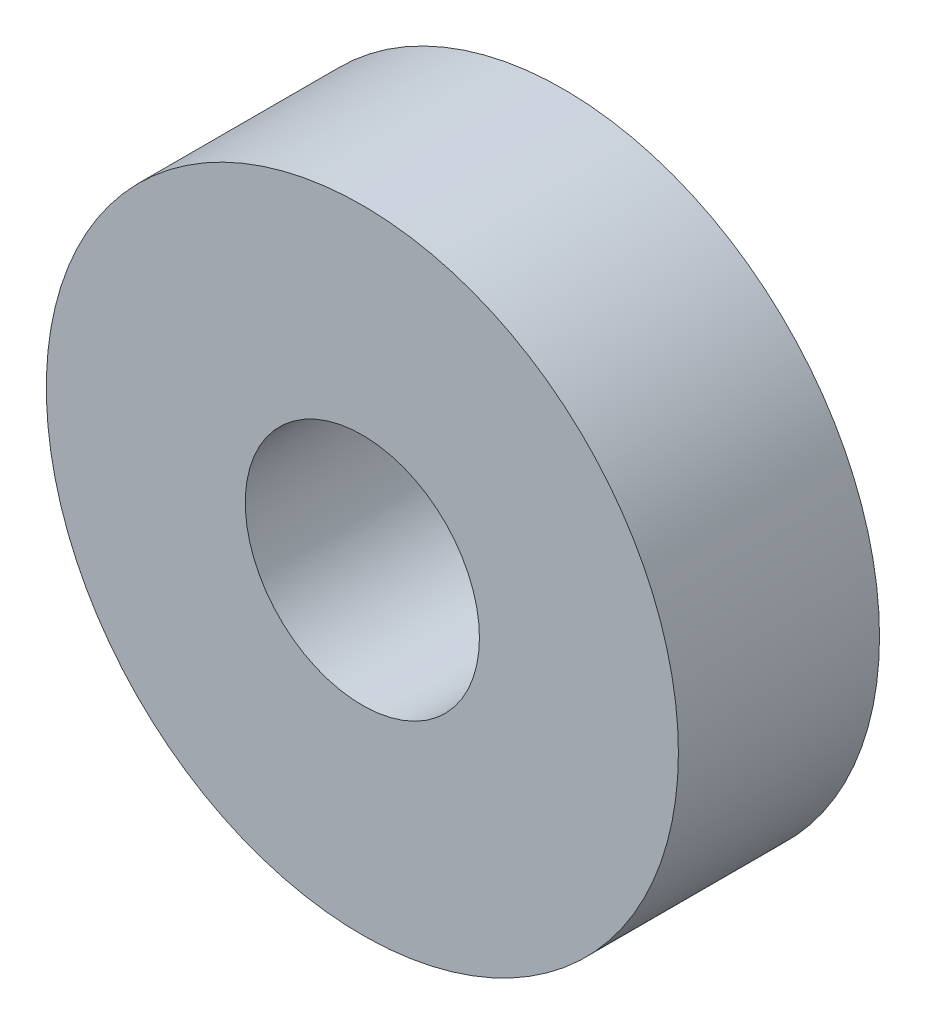
ISO-10303-21;
HEADER;
FILE_DESCRIPTION(('STEP AP214'),'2;1');
FILE_NAME('part.step','',(''),(''),'','','');
FILE_SCHEMA(('AUTOMOTIVE_DESIGN { 1 0 10303 214 1 1 1 1 }'));
ENDSEC;
DATA;
#1=APPLICATION_CONTEXT('core data for automotive mechanical design processes');
#2=APPLICATION_PROTOCOL_DEFINITION('international standard','automotive_design',2000,#1);
#3=PRODUCT_CONTEXT('',#1,'mechanical');
#4=PRODUCT('Part','Part','',(#3));
#5=PRODUCT_RELATED_PRODUCT_CATEGORY('part','',(#4));
#6=PRODUCT_DEFINITION_FORMATION('','',#4);
#7=PRODUCT_DEFINITION_CONTEXT('part definition',#1,'design');
#8=PRODUCT_DEFINITION('design','',#6,#7);
#9=PRODUCT_DEFINITION_SHAPE('','',#8);
#10=(LENGTH_UNIT() NAMED_UNIT(*) SI_UNIT(.MILLI.,.METRE.));
#11=(NAMED_UNIT(*) PLANE_ANGLE_UNIT() SI_UNIT($,.RADIAN.));
#12=(NAMED_UNIT(*) SI_UNIT($,.STERADIAN.) SOLID_ANGLE_UNIT());
#13=UNCERTAINTY_MEASURE_WITH_UNIT(LENGTH_MEASURE(1.E-05),#10,'distance_accuracy_value','');
#14=(GEOMETRIC_REPRESENTATION_CONTEXT(3) GLOBAL_UNCERTAINTY_ASSIGNED_CONTEXT((#13)) GLOBAL_UNIT_ASSIGNED_CONTEXT((#10,
#11,#12)) REPRESENTATION_CONTEXT('',''));
#15=CARTESIAN_POINT('',(0.,0.,0.));
#16=DIRECTION('',(0.,0.,1.));
#17=DIRECTION('',(1.,0.,0.));
#18=AXIS2_PLACEMENT_3D('',#15,#16,#17);
#19=CARTESIAN_POINT('',(0.,0.,7.));
#20=DIRECTION('',(0.,0.,1.));
#21=DIRECTION('',(1.,0.,0.));
#22=AXIS2_PLACEMENT_3D('',#19,#20,#21);
#23=PLANE('',#22);
#24=CARTESIAN_POINT('',(0.,0.,7.));
#25=DIRECTION('',(0.,0.,1.));
#26=DIRECTION('',(1.,0.,0.));
#27=AXIS2_PLACEMENT_3D('',#24,#25,#26);
#28=CIRCLE('',#27,11.);
#29=CARTESIAN_POINT('',(11.,0.,7.));
#30=VERTEX_POINT('',#29);
#31=EDGE_CURVE('E10',#30,#30,#28,.T.);
#32=ORIENTED_EDGE('',*,*,#31,.T.);
#33=EDGE_LOOP('',(#32));
#34=FACE_BOUND('',#33,.T.);
#35=CARTESIAN_POINT('',(0.,0.,7.));
#36=DIRECTION('',(0.,0.,1.));
#37=DIRECTION('',(1.,0.,0.));
#38=AXIS2_PLACEMENT_3D('',#35,#36,#37);
#39=CIRCLE('',#38,4.075);
#40=CARTESIAN_POINT('',(4.075,0.,7.));
#41=VERTEX_POINT('',#40);
#42=EDGE_CURVE('E52',#41,#41,#39,.T.);
#43=ORIENTED_EDGE('',*,*,#42,.F.);
#44=EDGE_LOOP('',(#43));
#45=FACE_BOUND('',#44,.T.);
#46=ADVANCED_FACE('F39',(#34,#45),#23,.T.);
#47=CARTESIAN_POINT('',(0.,0.,0.));
#48=DIRECTION('',(0.,0.,1.));
#49=DIRECTION('',(1.,0.,0.));
#50=AXIS2_PLACEMENT_3D('',#47,#48,#49);
#51=PLANE('',#50);
#52=CARTESIAN_POINT('',(0.,0.,0.));
#53=DIRECTION('',(0.,0.,1.));
#54=DIRECTION('',(1.,0.,0.));
#55=AXIS2_PLACEMENT_3D('',#52,#53,#54);
#56=CIRCLE('',#55,11.);
#57=CARTESIAN_POINT('',(11.,0.,0.));
#58=VERTEX_POINT('',#57);
#59=EDGE_CURVE('E43',#58,#58,#56,.T.);
#60=ORIENTED_EDGE('',*,*,#59,.F.);
#61=EDGE_LOOP('',(#60));
#62=FACE_BOUND('',#61,.T.);
#63=CARTESIAN_POINT('',(0.,0.,0.));
#64=DIRECTION('',(0.,0.,1.));
#65=DIRECTION('',(1.,0.,0.));
#66=AXIS2_PLACEMENT_3D('',#63,#64,#65);
#67=CIRCLE('',#66,4.075);
#68=CARTESIAN_POINT('',(4.075,0.,0.));
#69=VERTEX_POINT('',#68);
#70=EDGE_CURVE('E54',#69,#69,#67,.T.);
#71=ORIENTED_EDGE('',*,*,#70,.T.);
#72=EDGE_LOOP('',(#71));
#73=FACE_BOUND('',#72,.T.);
#74=ADVANCED_FACE('F66',(#62,#73),#51,.F.);
#75=CARTESIAN_POINT('',(0.,0.,7.));
#76=DIRECTION('',(0.,0.,-1.));
#77=DIRECTION('',(-1.,0.,0.));
#78=AXIS2_PLACEMENT_3D('',#75,#76,#77);
#79=CYLINDRICAL_SURFACE('',#78,11.);
#80=ORIENTED_EDGE('',*,*,#31,.F.);
#81=EDGE_LOOP('',(#80));
#82=FACE_BOUND('',#81,.T.);
#83=ORIENTED_EDGE('',*,*,#59,.T.);
#84=EDGE_LOOP('',(#83));
#85=FACE_BOUND('',#84,.T.);
#86=ADVANCED_FACE('F41',(#82,#85),#79,.T.);
#87=CARTESIAN_POINT('',(0.,0.,7.));
#88=DIRECTION('',(0.,0.,-1.));
#89=DIRECTION('',(-1.,0.,0.));
#90=AXIS2_PLACEMENT_3D('',#87,#88,#89);
#91=CYLINDRICAL_SURFACE('',#90,4.075);
#92=ORIENTED_EDGE('',*,*,#42,.T.);
#93=EDGE_LOOP('',(#92));
#94=FACE_BOUND('',#93,.T.);
#95=ORIENTED_EDGE('',*,*,#70,.F.);
#96=EDGE_LOOP('',(#95));
#97=FACE_BOUND('',#96,.T.);
#98=ADVANCED_FACE('F62',(#94,#97),#91,.F.);
#99=CLOSED_SHELL('',(#46,#74,#86,#98));
#100=MANIFOLD_SOLID_BREP('B2',#99);
#101=ADVANCED_BREP_SHAPE_REPRESENTATION('',(#18,#100),#14);
#102=SHAPE_DEFINITION_REPRESENTATION(#9,#101);
ENDSEC;
END-ISO-10303-21;
